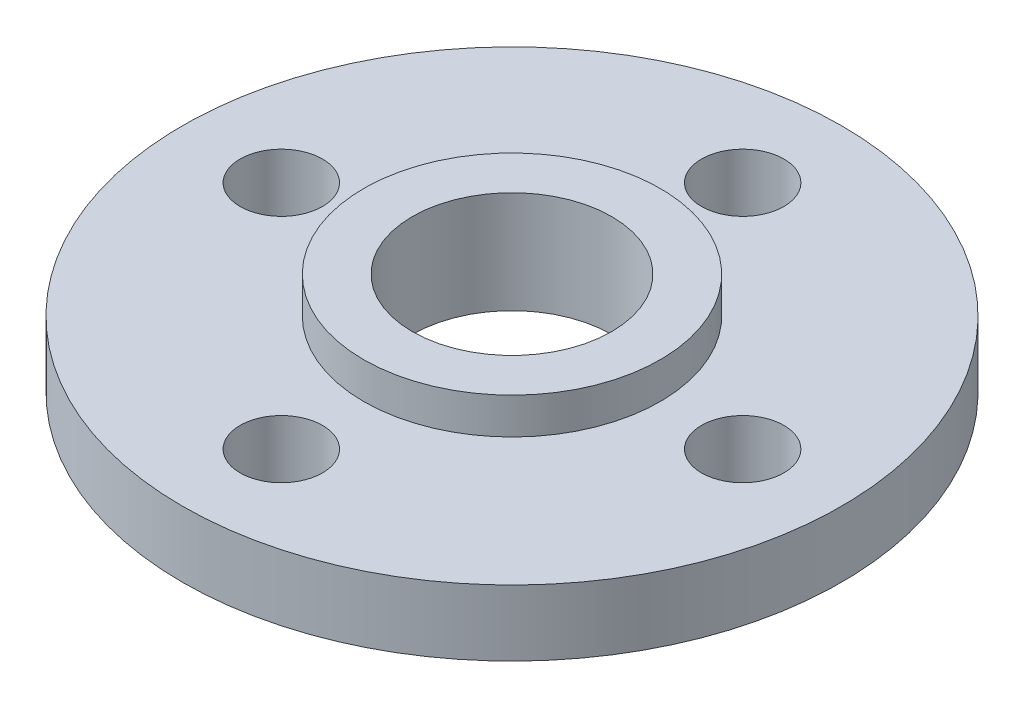
ISO-10303-21;
HEADER;
FILE_DESCRIPTION(('STEP AP214'),'2;1');
FILE_NAME('part.step','',(''),(''),'','','');
FILE_SCHEMA(('AUTOMOTIVE_DESIGN { 1 0 10303 214 1 1 1 1 }'));
ENDSEC;
DATA;
#1=APPLICATION_CONTEXT('core data for automotive mechanical design processes');
#2=APPLICATION_PROTOCOL_DEFINITION('international standard','automotive_design',2000,#1);
#3=PRODUCT_CONTEXT('',#1,'mechanical');
#4=PRODUCT('Part','Part','',(#3));
#5=PRODUCT_RELATED_PRODUCT_CATEGORY('part','',(#4));
#6=PRODUCT_DEFINITION_FORMATION('','',#4);
#7=PRODUCT_DEFINITION_CONTEXT('part definition',#1,'design');
#8=PRODUCT_DEFINITION('design','',#6,#7);
#9=PRODUCT_DEFINITION_SHAPE('','',#8);
#10=(LENGTH_UNIT() NAMED_UNIT(*) SI_UNIT(.MILLI.,.METRE.));
#11=(NAMED_UNIT(*) PLANE_ANGLE_UNIT() SI_UNIT($,.RADIAN.));
#12=(NAMED_UNIT(*) SI_UNIT($,.STERADIAN.) SOLID_ANGLE_UNIT());
#13=UNCERTAINTY_MEASURE_WITH_UNIT(LENGTH_MEASURE(1.E-05),#10,'distance_accuracy_value','');
#14=(GEOMETRIC_REPRESENTATION_CONTEXT(3) GLOBAL_UNCERTAINTY_ASSIGNED_CONTEXT((#13)) GLOBAL_UNIT_ASSIGNED_CONTEXT((#10,
#11,#12)) REPRESENTATION_CONTEXT('',''));
#15=CARTESIAN_POINT('',(0.,0.,0.));
#16=DIRECTION('',(0.,0.,1.));
#17=DIRECTION('',(1.,0.,0.));
#18=AXIS2_PLACEMENT_3D('',#15,#16,#17);
#19=CARTESIAN_POINT('',(0.,2.,0.));
#20=DIRECTION('',(0.,-1.,0.));
#21=DIRECTION('',(0.,0.,-1.));
#22=AXIS2_PLACEMENT_3D('',#19,#20,#21);
#23=CYLINDRICAL_SURFACE('',#22,10.);
#24=CARTESIAN_POINT('',(0.,2.,0.));
#25=DIRECTION('',(0.,1.,0.));
#26=DIRECTION('',(0.,0.,1.));
#27=AXIS2_PLACEMENT_3D('',#24,#25,#26);
#28=CIRCLE('',#27,10.);
#29=CARTESIAN_POINT('',(0.,2.,10.));
#30=VERTEX_POINT('',#29);
#31=EDGE_CURVE('E10',#30,#30,#28,.T.);
#32=ORIENTED_EDGE('',*,*,#31,.F.);
#33=EDGE_LOOP('',(#32));
#34=FACE_BOUND('',#33,.T.);
#35=CARTESIAN_POINT('',(0.,0.,0.));
#36=DIRECTION('',(0.,1.,0.));
#37=DIRECTION('',(0.,0.,1.));
#38=AXIS2_PLACEMENT_3D('',#35,#36,#37);
#39=CIRCLE('',#38,10.);
#40=CARTESIAN_POINT('',(0.,0.,10.));
#41=VERTEX_POINT('',#40);
#42=EDGE_CURVE('E36',#41,#41,#39,.T.);
#43=ORIENTED_EDGE('',*,*,#42,.T.);
#44=EDGE_LOOP('',(#43));
#45=FACE_BOUND('',#44,.T.);
#46=ADVANCED_FACE('F33',(#34,#45),#23,.T.);
#47=CARTESIAN_POINT('',(0.,2.,0.));
#48=DIRECTION('',(0.,1.,0.));
#49=DIRECTION('',(0.,0.,1.));
#50=AXIS2_PLACEMENT_3D('',#47,#48,#49);
#51=PLANE('',#50);
#52=CARTESIAN_POINT('',(7.,2.,0.));
#53=DIRECTION('',(0.,1.,0.));
#54=DIRECTION('',(0.,0.,1.));
#55=AXIS2_PLACEMENT_3D('',#52,#53,#54);
#56=CIRCLE('',#55,1.25);
#57=CARTESIAN_POINT('',(7.,2.,1.25000000000003));
#58=VERTEX_POINT('',#57);
#59=EDGE_CURVE('E73',#58,#58,#56,.T.);
#60=ORIENTED_EDGE('',*,*,#59,.F.);
#61=EDGE_LOOP('',(#60));
#62=FACE_BOUND('',#61,.T.);
#63=CARTESIAN_POINT('',(3.9724512764323E-13,2.,7.));
#64=DIRECTION('',(0.,1.,0.));
#65=DIRECTION('',(0.,0.,1.));
#66=AXIS2_PLACEMENT_3D('',#63,#64,#65);
#67=CIRCLE('',#66,1.25000000000043);
#68=CARTESIAN_POINT('',(3.9724512764323E-13,2.,8.25000000000043));
#69=VERTEX_POINT('',#68);
#70=EDGE_CURVE('E66',#69,#69,#67,.T.);
#71=ORIENTED_EDGE('',*,*,#70,.F.);
#72=EDGE_LOOP('',(#71));
#73=FACE_BOUND('',#72,.T.);
#74=CARTESIAN_POINT('',(-7.,2.,0.));
#75=DIRECTION('',(0.,1.,0.));
#76=DIRECTION('',(0.,0.,1.));
#77=AXIS2_PLACEMENT_3D('',#74,#75,#76);
#78=CIRCLE('',#77,1.25);
#79=CARTESIAN_POINT('',(-7.,2.,1.24999999999993));
#80=VERTEX_POINT('',#79);
#81=EDGE_CURVE('E67',#80,#80,#78,.T.);
#82=ORIENTED_EDGE('',*,*,#81,.F.);
#83=EDGE_LOOP('',(#82));
#84=FACE_BOUND('',#83,.T.);
#85=CARTESIAN_POINT('',(0.,2.,-7.));
#86=DIRECTION('',(0.,1.,0.));
#87=DIRECTION('',(0.,0.,1.));
#88=AXIS2_PLACEMENT_3D('',#85,#86,#87);
#89=CIRCLE('',#88,1.25);
#90=CARTESIAN_POINT('',(0.,2.,-5.75));
#91=VERTEX_POINT('',#90);
#92=EDGE_CURVE('E59',#91,#91,#89,.T.);
#93=ORIENTED_EDGE('',*,*,#92,.F.);
#94=EDGE_LOOP('',(#93));
#95=FACE_BOUND('',#94,.T.);
#96=CARTESIAN_POINT('',(0.,2.,0.));
#97=DIRECTION('',(0.,1.,0.));
#98=DIRECTION('',(0.,0.,1.));
#99=AXIS2_PLACEMENT_3D('',#96,#97,#98);
#100=CIRCLE('',#99,4.5);
#101=CARTESIAN_POINT('',(0.,2.,4.5));
#102=VERTEX_POINT('',#101);
#103=EDGE_CURVE('E45',#102,#102,#100,.T.);
#104=ORIENTED_EDGE('',*,*,#103,.F.);
#105=EDGE_LOOP('',(#104));
#106=FACE_BOUND('',#105,.T.);
#107=ORIENTED_EDGE('',*,*,#31,.T.);
#108=EDGE_LOOP('',(#107));
#109=FACE_BOUND('',#108,.T.);
#110=ADVANCED_FACE('F84',(#62,#73,#84,#95,#106,#109),#51,.T.);
#111=CARTESIAN_POINT('',(0.,0.,0.));
#112=DIRECTION('',(0.,1.,0.));
#113=DIRECTION('',(0.,0.,1.));
#114=AXIS2_PLACEMENT_3D('',#111,#112,#113);
#115=PLANE('',#114);
#116=CARTESIAN_POINT('',(7.,0.,0.));
#117=DIRECTION('',(0.,1.,0.));
#118=DIRECTION('',(0.,0.,1.));
#119=AXIS2_PLACEMENT_3D('',#116,#117,#118);
#120=CIRCLE('',#119,1.25);
#121=CARTESIAN_POINT('',(7.,0.,1.25000000000003));
#122=VERTEX_POINT('',#121);
#123=EDGE_CURVE('E62',#122,#122,#120,.F.);
#124=ORIENTED_EDGE('',*,*,#123,.F.);
#125=EDGE_LOOP('',(#124));
#126=FACE_BOUND('',#125,.T.);
#127=CARTESIAN_POINT('',(3.9724512764323E-13,0.,7.));
#128=DIRECTION('',(0.,1.,0.));
#129=DIRECTION('',(0.,0.,1.));
#130=AXIS2_PLACEMENT_3D('',#127,#128,#129);
#131=CIRCLE('',#130,1.25000000000043);
#132=CARTESIAN_POINT('',(3.9724512764323E-13,0.,8.25000000000043));
#133=VERTEX_POINT('',#132);
#134=EDGE_CURVE('E70',#133,#133,#131,.F.);
#135=ORIENTED_EDGE('',*,*,#134,.F.);
#136=EDGE_LOOP('',(#135));
#137=FACE_BOUND('',#136,.T.);
#138=CARTESIAN_POINT('',(-7.,0.,0.));
#139=DIRECTION('',(0.,1.,0.));
#140=DIRECTION('',(0.,0.,1.));
#141=AXIS2_PLACEMENT_3D('',#138,#139,#140);
#142=CIRCLE('',#141,1.25);
#143=CARTESIAN_POINT('',(-7.,0.,1.24999999999993));
#144=VERTEX_POINT('',#143);
#145=EDGE_CURVE('E63',#144,#144,#142,.F.);
#146=ORIENTED_EDGE('',*,*,#145,.F.);
#147=EDGE_LOOP('',(#146));
#148=FACE_BOUND('',#147,.T.);
#149=CARTESIAN_POINT('',(0.,0.,-7.));
#150=DIRECTION('',(0.,1.,0.));
#151=DIRECTION('',(0.,0.,1.));
#152=AXIS2_PLACEMENT_3D('',#149,#150,#151);
#153=CIRCLE('',#152,1.25);
#154=CARTESIAN_POINT('',(0.,0.,-5.75));
#155=VERTEX_POINT('',#154);
#156=EDGE_CURVE('E56',#155,#155,#153,.F.);
#157=ORIENTED_EDGE('',*,*,#156,.F.);
#158=EDGE_LOOP('',(#157));
#159=FACE_BOUND('',#158,.T.);
#160=CARTESIAN_POINT('',(0.,0.,0.));
#161=DIRECTION('',(0.,1.,0.));
#162=DIRECTION('',(0.,0.,1.));
#163=AXIS2_PLACEMENT_3D('',#160,#161,#162);
#164=CIRCLE('',#163,3.025);
#165=CARTESIAN_POINT('',(0.,0.,3.025));
#166=VERTEX_POINT('',#165);
#167=EDGE_CURVE('E48',#166,#166,#164,.F.);
#168=ORIENTED_EDGE('',*,*,#167,.F.);
#169=EDGE_LOOP('',(#168));
#170=FACE_BOUND('',#169,.T.);
#171=ORIENTED_EDGE('',*,*,#42,.F.);
#172=EDGE_LOOP('',(#171));
#173=FACE_BOUND('',#172,.T.);
#174=ADVANCED_FACE('F87',(#126,#137,#148,#159,#170,#173),#115,.F.);
#175=CARTESIAN_POINT('',(0.,3.1,0.));
#176=DIRECTION('',(0.,-1.,0.));
#177=DIRECTION('',(0.,0.,-1.));
#178=AXIS2_PLACEMENT_3D('',#175,#176,#177);
#179=CYLINDRICAL_SURFACE('',#178,4.5);
#180=CARTESIAN_POINT('',(0.,3.1,0.));
#181=DIRECTION('',(0.,1.,0.));
#182=DIRECTION('',(0.,0.,1.));
#183=AXIS2_PLACEMENT_3D('',#180,#181,#182);
#184=CIRCLE('',#183,4.5);
#185=CARTESIAN_POINT('',(0.,3.1,4.5));
#186=VERTEX_POINT('',#185);
#187=EDGE_CURVE('E43',#186,#186,#184,.T.);
#188=ORIENTED_EDGE('',*,*,#187,.F.);
#189=EDGE_LOOP('',(#188));
#190=FACE_BOUND('',#189,.T.);
#191=ORIENTED_EDGE('',*,*,#103,.T.);
#192=EDGE_LOOP('',(#191));
#193=FACE_BOUND('',#192,.T.);
#194=ADVANCED_FACE('F97',(#190,#193),#179,.T.);
#195=CARTESIAN_POINT('',(0.,3.1,0.));
#196=DIRECTION('',(0.,1.,0.));
#197=DIRECTION('',(0.,0.,1.));
#198=AXIS2_PLACEMENT_3D('',#195,#196,#197);
#199=PLANE('',#198);
#200=CARTESIAN_POINT('',(0.,3.1,0.));
#201=DIRECTION('',(0.,1.,0.));
#202=DIRECTION('',(0.,0.,1.));
#203=AXIS2_PLACEMENT_3D('',#200,#201,#202);
#204=CIRCLE('',#203,3.025);
#205=CARTESIAN_POINT('',(0.,3.1,3.025));
#206=VERTEX_POINT('',#205);
#207=EDGE_CURVE('E53',#206,#206,#204,.T.);
#208=ORIENTED_EDGE('',*,*,#207,.F.);
#209=EDGE_LOOP('',(#208));
#210=FACE_BOUND('',#209,.T.);
#211=ORIENTED_EDGE('',*,*,#187,.T.);
#212=EDGE_LOOP('',(#211));
#213=FACE_BOUND('',#212,.T.);
#214=ADVANCED_FACE('F99',(#210,#213),#199,.T.);
#215=CARTESIAN_POINT('',(0.,-0.00100000000000013,0.));
#216=DIRECTION('',(0.,1.,0.));
#217=DIRECTION('',(0.,0.,1.));
#218=AXIS2_PLACEMENT_3D('',#215,#216,#217);
#219=CYLINDRICAL_SURFACE('',#218,3.025);
#220=ORIENTED_EDGE('',*,*,#207,.T.);
#221=EDGE_LOOP('',(#220));
#222=FACE_BOUND('',#221,.T.);
#223=ORIENTED_EDGE('',*,*,#167,.T.);
#224=EDGE_LOOP('',(#223));
#225=FACE_BOUND('',#224,.T.);
#226=ADVANCED_FACE('F106',(#222,#225),#219,.F.);
#227=CARTESIAN_POINT('',(0.,-0.00100000000000013,-7.));
#228=DIRECTION('',(0.,1.,0.));
#229=DIRECTION('',(0.,0.,1.));
#230=AXIS2_PLACEMENT_3D('',#227,#228,#229);
#231=CYLINDRICAL_SURFACE('',#230,1.25);
#232=ORIENTED_EDGE('',*,*,#92,.T.);
#233=EDGE_LOOP('',(#232));
#234=FACE_BOUND('',#233,.T.);
#235=ORIENTED_EDGE('',*,*,#156,.T.);
#236=EDGE_LOOP('',(#235));
#237=FACE_BOUND('',#236,.T.);
#238=ADVANCED_FACE('F133',(#234,#237),#231,.F.);
#239=CARTESIAN_POINT('',(-7.,-0.00100000000000013,0.));
#240=DIRECTION('',(0.,1.,0.));
#241=DIRECTION('',(0.,0.,1.));
#242=AXIS2_PLACEMENT_3D('',#239,#240,#241);
#243=CYLINDRICAL_SURFACE('',#242,1.25);
#244=ORIENTED_EDGE('',*,*,#81,.T.);
#245=EDGE_LOOP('',(#244));
#246=FACE_BOUND('',#245,.T.);
#247=ORIENTED_EDGE('',*,*,#145,.T.);
#248=EDGE_LOOP('',(#247));
#249=FACE_BOUND('',#248,.T.);
#250=ADVANCED_FACE('F138',(#246,#249),#243,.F.);
#251=CARTESIAN_POINT('',(3.9724512764323E-13,-0.00100000000000013,7.));
#252=DIRECTION('',(0.,1.,0.));
#253=DIRECTION('',(0.,0.,1.));
#254=AXIS2_PLACEMENT_3D('',#251,#252,#253);
#255=CYLINDRICAL_SURFACE('',#254,1.25000000000043);
#256=ORIENTED_EDGE('',*,*,#70,.T.);
#257=EDGE_LOOP('',(#256));
#258=FACE_BOUND('',#257,.T.);
#259=ORIENTED_EDGE('',*,*,#134,.T.);
#260=EDGE_LOOP('',(#259));
#261=FACE_BOUND('',#260,.T.);
#262=ADVANCED_FACE('F150',(#258,#261),#255,.F.);
#263=CARTESIAN_POINT('',(7.,-0.00100000000000013,0.));
#264=DIRECTION('',(0.,1.,0.));
#265=DIRECTION('',(0.,0.,1.));
#266=AXIS2_PLACEMENT_3D('',#263,#264,#265);
#267=CYLINDRICAL_SURFACE('',#266,1.25);
#268=ORIENTED_EDGE('',*,*,#59,.T.);
#269=EDGE_LOOP('',(#268));
#270=FACE_BOUND('',#269,.T.);
#271=ORIENTED_EDGE('',*,*,#123,.T.);
#272=EDGE_LOOP('',(#271));
#273=FACE_BOUND('',#272,.T.);
#274=ADVANCED_FACE('F81',(#270,#273),#267,.F.);
#275=CLOSED_SHELL('',(#46,#110,#174,#194,#214,#226,#238,#250,#262,#274));
#276=MANIFOLD_SOLID_BREP('B2',#275);
#277=ADVANCED_BREP_SHAPE_REPRESENTATION('',(#18,#276),#14);
#278=SHAPE_DEFINITION_REPRESENTATION(#9,#277);
ENDSEC;
END-ISO-10303-21;
